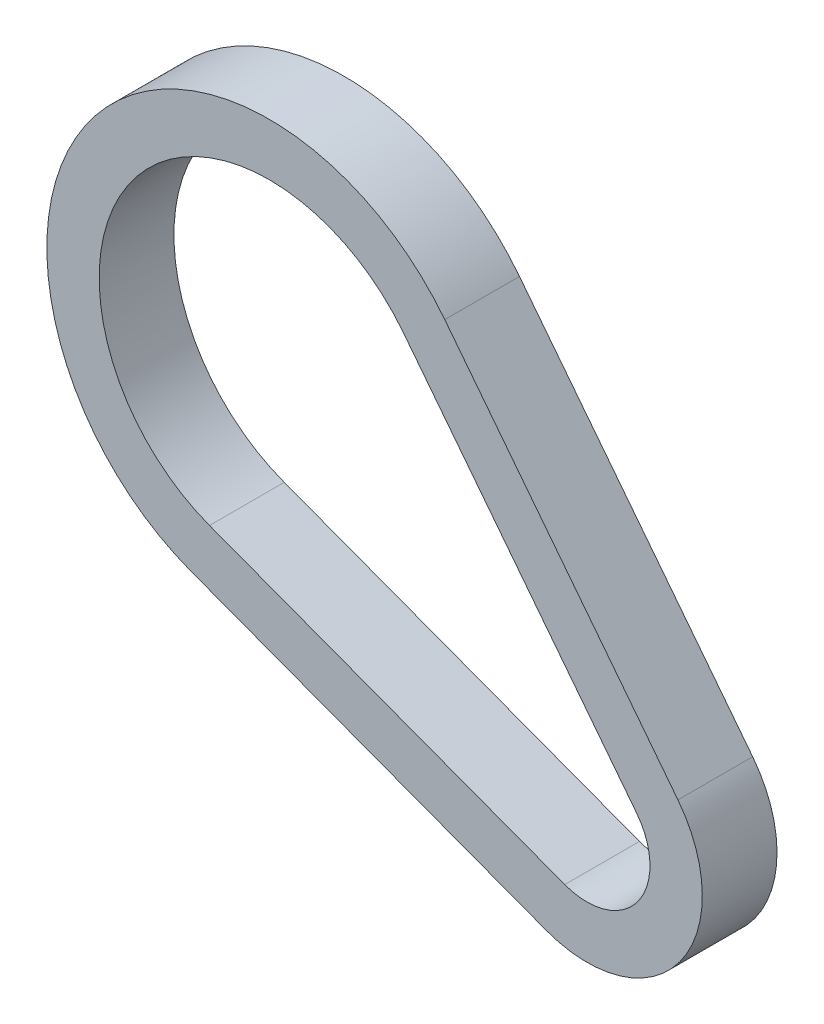
ISO-10303-21;
HEADER;
FILE_DESCRIPTION(('STEP AP214'),'2;1');
FILE_NAME('part.step','',(''),(''),'','','');
FILE_SCHEMA(('AUTOMOTIVE_DESIGN { 1 0 10303 214 1 1 1 1 }'));
ENDSEC;
DATA;
#1=APPLICATION_CONTEXT('core data for automotive mechanical design processes');
#2=APPLICATION_PROTOCOL_DEFINITION('international standard','automotive_design',2000,#1);
#3=PRODUCT_CONTEXT('',#1,'mechanical');
#4=PRODUCT('Part','Part','',(#3));
#5=PRODUCT_RELATED_PRODUCT_CATEGORY('part','',(#4));
#6=PRODUCT_DEFINITION_FORMATION('','',#4);
#7=PRODUCT_DEFINITION_CONTEXT('part definition',#1,'design');
#8=PRODUCT_DEFINITION('design','',#6,#7);
#9=PRODUCT_DEFINITION_SHAPE('','',#8);
#10=(LENGTH_UNIT() NAMED_UNIT(*) SI_UNIT(.MILLI.,.METRE.));
#11=(NAMED_UNIT(*) PLANE_ANGLE_UNIT() SI_UNIT($,.RADIAN.));
#12=(NAMED_UNIT(*) SI_UNIT($,.STERADIAN.) SOLID_ANGLE_UNIT());
#13=UNCERTAINTY_MEASURE_WITH_UNIT(LENGTH_MEASURE(1.E-05),#10,'distance_accuracy_value','');
#14=(GEOMETRIC_REPRESENTATION_CONTEXT(3) GLOBAL_UNCERTAINTY_ASSIGNED_CONTEXT((#13)) GLOBAL_UNIT_ASSIGNED_CONTEXT((#10,
#11,#12)) REPRESENTATION_CONTEXT('',''));
#15=CARTESIAN_POINT('',(0.,0.,0.));
#16=DIRECTION('',(0.,0.,1.));
#17=DIRECTION('',(1.,0.,0.));
#18=AXIS2_PLACEMENT_3D('',#15,#16,#17);
#19=CARTESIAN_POINT('',(0.,-1.26999999999999,6.35));
#20=DIRECTION('',(0.,0.,-1.));
#21=DIRECTION('',(-1.,0.,0.));
#22=AXIS2_PLACEMENT_3D('',#19,#20,#21);
#23=PLANE('',#22);
#24=CARTESIAN_POINT('',(0.,-1.26999999999999,6.35));
#25=DIRECTION('',(0.,0.,-1.));
#26=DIRECTION('',(-1.,0.,0.));
#27=AXIS2_PLACEMENT_3D('',#24,#25,#26);
#28=CIRCLE('',#27,37.7959183249067);
#29=CARTESIAN_POINT('',(29.8174975578945,21.9560259495241,6.35));
#30=VERTEX_POINT('',#29);
#31=CARTESIAN_POINT('',(-13.2817369108515,-36.6554052775143,6.35000000000001));
#32=VERTEX_POINT('',#31);
#33=EDGE_CURVE('E160',#30,#32,#28,.F.);
#34=ORIENTED_EDGE('',*,*,#33,.T.);
#35=DIRECTION('',(0.936222926860231,-0.351406646524028,0.));
#36=VECTOR('',#35,1.);
#37=CARTESIAN_POINT('',(-13.2817369108515,-36.6554052775144,6.35));
#38=LINE('',#37,#36);
#39=CARTESIAN_POINT('',(47.0858454711772,-59.3140788423401,6.35000000000001));
#40=VERTEX_POINT('',#39);
#41=EDGE_CURVE('E163',#32,#40,#38,.T.);
#42=ORIENTED_EDGE('',*,*,#41,.T.);
#43=CARTESIAN_POINT('',(53.9750000000002,-40.959888674437,6.35));
#44=DIRECTION('',(0.,0.,-1.));
#45=DIRECTION('',(-1.,0.,0.));
#46=AXIS2_PLACEMENT_3D('',#43,#44,#45);
#47=CIRCLE('',#46,19.604508329503);
#48=CARTESIAN_POINT('',(69.4411509799453,-28.9126931208197,6.35));
#49=VERTEX_POINT('',#48);
#50=EDGE_CURVE('E166',#40,#49,#47,.F.);
#51=ORIENTED_EDGE('',*,*,#50,.T.);
#52=DIRECTION('',(-0.614511486395575,0.788907873637918,0.));
#53=VECTOR('',#52,1.);
#54=CARTESIAN_POINT('',(29.8174975578946,21.9560259495241,6.35));
#55=LINE('',#54,#53);
#56=EDGE_CURVE('E168',#49,#30,#55,.T.);
#57=ORIENTED_EDGE('',*,*,#56,.T.);
#58=EDGE_LOOP('',(#34,#42,#51,#57));
#59=FACE_BOUND('',#58,.T.);
#60=CARTESIAN_POINT('',(0.,-1.26999999999999,6.35));
#61=DIRECTION('',(0.,0.,-1.));
#62=DIRECTION('',(-1.,0.,0.));
#63=AXIS2_PLACEMENT_3D('',#60,#61,#62);
#64=CIRCLE('',#63,28.9059183249067);
#65=CARTESIAN_POINT('',(22.8041065612535,16.4930188354675,6.35));
#66=VERTEX_POINT('',#65);
#67=CARTESIAN_POINT('',(-10.1577318232529,-28.3323834577269,6.35000000000001));
#68=VERTEX_POINT('',#67);
#69=EDGE_CURVE('E124',#66,#68,#64,.F.);
#70=ORIENTED_EDGE('',*,*,#69,.F.);
#71=DIRECTION('',(-0.614511486395575,0.788907873637918,0.));
#72=VECTOR('',#71,1.);
#73=CARTESIAN_POINT('',(22.8041065612535,16.4930188354675,6.35));
#74=LINE('',#73,#72);
#75=CARTESIAN_POINT('',(62.4277599833042,-34.3757002348763,6.35));
#76=VERTEX_POINT('',#75);
#77=EDGE_CURVE('E146',#76,#66,#74,.T.);
#78=ORIENTED_EDGE('',*,*,#77,.F.);
#79=CARTESIAN_POINT('',(53.9750000000002,-40.959888674437,6.35));
#80=DIRECTION('',(0.,0.,-1.));
#81=DIRECTION('',(-1.,0.,0.));
#82=AXIS2_PLACEMENT_3D('',#79,#80,#81);
#83=CIRCLE('',#82,10.714508329503);
#84=CARTESIAN_POINT('',(50.2098505587758,-50.9910570225527,6.35000000000001));
#85=VERTEX_POINT('',#84);
#86=EDGE_CURVE('E144',#85,#76,#83,.F.);
#87=ORIENTED_EDGE('',*,*,#86,.F.);
#88=DIRECTION('',(0.936222926860231,-0.351406646524028,0.));
#89=VECTOR('',#88,1.);
#90=CARTESIAN_POINT('',(-10.1577318232529,-28.3323834577269,6.35));
#91=LINE('',#90,#89);
#92=EDGE_CURVE('E132',#68,#85,#91,.T.);
#93=ORIENTED_EDGE('',*,*,#92,.F.);
#94=EDGE_LOOP('',(#70,#78,#87,#93));
#95=FACE_BOUND('',#94,.T.);
#96=ADVANCED_FACE('F59',(#59,#95),#23,.F.);
#97=CARTESIAN_POINT('',(0.,-1.26999999999999,-6.35));
#98=DIRECTION('',(0.,0.,-1.));
#99=DIRECTION('',(-1.,0.,0.));
#100=AXIS2_PLACEMENT_3D('',#97,#98,#99);
#101=PLANE('',#100);
#102=CARTESIAN_POINT('',(0.,-1.26999999999999,-6.35));
#103=DIRECTION('',(0.,0.,-1.));
#104=DIRECTION('',(-1.,0.,0.));
#105=AXIS2_PLACEMENT_3D('',#102,#103,#104);
#106=CIRCLE('',#105,37.7959183249067);
#107=CARTESIAN_POINT('',(29.8174975578945,21.9560259495241,-6.35));
#108=VERTEX_POINT('',#107);
#109=CARTESIAN_POINT('',(-13.2817369108515,-36.6554052775143,-6.34999999999999));
#110=VERTEX_POINT('',#109);
#111=EDGE_CURVE('E140',#108,#110,#106,.F.);
#112=ORIENTED_EDGE('',*,*,#111,.F.);
#113=DIRECTION('',(-0.614511486395575,0.788907873637918,0.));
#114=VECTOR('',#113,1.);
#115=CARTESIAN_POINT('',(29.8174975578946,21.9560259495241,-6.35));
#116=LINE('',#115,#114);
#117=CARTESIAN_POINT('',(69.4411509799453,-28.9126931208197,-6.35));
#118=VERTEX_POINT('',#117);
#119=EDGE_CURVE('E164',#118,#108,#116,.T.);
#120=ORIENTED_EDGE('',*,*,#119,.F.);
#121=CARTESIAN_POINT('',(53.9750000000002,-40.959888674437,-6.35));
#122=DIRECTION('',(0.,0.,-1.));
#123=DIRECTION('',(-1.,0.,0.));
#124=AXIS2_PLACEMENT_3D('',#121,#122,#123);
#125=CIRCLE('',#124,19.604508329503);
#126=CARTESIAN_POINT('',(47.0858454711772,-59.3140788423401,-6.34999999999999));
#127=VERTEX_POINT('',#126);
#128=EDGE_CURVE('E175',#127,#118,#125,.F.);
#129=ORIENTED_EDGE('',*,*,#128,.F.);
#130=DIRECTION('',(0.936222926860231,-0.351406646524028,0.));
#131=VECTOR('',#130,1.);
#132=CARTESIAN_POINT('',(-13.2817369108515,-36.6554052775144,-6.35));
#133=LINE('',#132,#131);
#134=EDGE_CURVE('E173',#110,#127,#133,.T.);
#135=ORIENTED_EDGE('',*,*,#134,.F.);
#136=EDGE_LOOP('',(#112,#120,#129,#135));
#137=FACE_BOUND('',#136,.T.);
#138=DIRECTION('',(-0.614511486395575,0.788907873637918,0.));
#139=VECTOR('',#138,1.);
#140=CARTESIAN_POINT('',(22.8041065612535,16.4930188354675,-6.35));
#141=LINE('',#140,#139);
#142=CARTESIAN_POINT('',(62.4277599833042,-34.3757002348763,-6.35));
#143=VERTEX_POINT('',#142);
#144=CARTESIAN_POINT('',(22.8041065612535,16.4930188354675,-6.35));
#145=VERTEX_POINT('',#144);
#146=EDGE_CURVE('E133',#143,#145,#141,.T.);
#147=ORIENTED_EDGE('',*,*,#146,.T.);
#148=CARTESIAN_POINT('',(0.,-1.26999999999999,-6.35));
#149=DIRECTION('',(0.,0.,-1.));
#150=DIRECTION('',(-1.,0.,0.));
#151=AXIS2_PLACEMENT_3D('',#148,#149,#150);
#152=CIRCLE('',#151,28.9059183249067);
#153=CARTESIAN_POINT('',(-10.1577318232529,-28.3323834577269,-6.34999999999999));
#154=VERTEX_POINT('',#153);
#155=EDGE_CURVE('E82',#145,#154,#152,.F.);
#156=ORIENTED_EDGE('',*,*,#155,.T.);
#157=DIRECTION('',(0.936222926860231,-0.351406646524028,0.));
#158=VECTOR('',#157,1.);
#159=CARTESIAN_POINT('',(-10.1577318232529,-28.3323834577269,-6.35));
#160=LINE('',#159,#158);
#161=CARTESIAN_POINT('',(50.2098505587758,-50.9910570225527,-6.34999999999999));
#162=VERTEX_POINT('',#161);
#163=EDGE_CURVE('E139',#154,#162,#160,.T.);
#164=ORIENTED_EDGE('',*,*,#163,.T.);
#165=CARTESIAN_POINT('',(53.9750000000002,-40.959888674437,-6.35));
#166=DIRECTION('',(0.,0.,-1.));
#167=DIRECTION('',(-1.,0.,0.));
#168=AXIS2_PLACEMENT_3D('',#165,#166,#167);
#169=CIRCLE('',#168,10.714508329503);
#170=EDGE_CURVE('E152',#162,#143,#169,.F.);
#171=ORIENTED_EDGE('',*,*,#170,.T.);
#172=EDGE_LOOP('',(#147,#156,#164,#171));
#173=FACE_BOUND('',#172,.T.);
#174=ADVANCED_FACE('F193',(#137,#173),#101,.T.);
#175=CARTESIAN_POINT('',(0.,-1.26999999999999,6.35));
#176=DIRECTION('',(0.,0.,-1.));
#177=DIRECTION('',(-1.,0.,0.));
#178=AXIS2_PLACEMENT_3D('',#175,#176,#177);
#179=CYLINDRICAL_SURFACE('',#178,37.7959183249067);
#180=ORIENTED_EDGE('',*,*,#111,.T.);
#181=DIRECTION('',(0.,0.,-1.));
#182=VECTOR('',#181,1.);
#183=CARTESIAN_POINT('',(-13.2817369108515,-36.6554052775143,6.35000000000001));
#184=LINE('',#183,#182);
#185=EDGE_CURVE('E12',#32,#110,#184,.T.);
#186=ORIENTED_EDGE('',*,*,#185,.F.);
#187=ORIENTED_EDGE('',*,*,#33,.F.);
#188=DIRECTION('',(0.,0.,-1.));
#189=VECTOR('',#188,1.);
#190=CARTESIAN_POINT('',(29.8174975578945,21.9560259495241,6.35));
#191=LINE('',#190,#189);
#192=EDGE_CURVE('E170',#30,#108,#191,.T.);
#193=ORIENTED_EDGE('',*,*,#192,.T.);
#194=EDGE_LOOP('',(#180,#186,#187,#193));
#195=FACE_BOUND('',#194,.T.);
#196=ADVANCED_FACE('F61',(#195),#179,.T.);
#197=CARTESIAN_POINT('',(-13.2817369108515,-36.6554052775144,6.35));
#198=DIRECTION('',(0.351406646524028,0.93622292686023,0.));
#199=DIRECTION('',(-0.936222926860231,0.351406646524028,0.));
#200=AXIS2_PLACEMENT_3D('',#197,#198,#199);
#201=PLANE('',#200);
#202=ORIENTED_EDGE('',*,*,#134,.T.);
#203=DIRECTION('',(0.,0.,-1.));
#204=VECTOR('',#203,1.);
#205=CARTESIAN_POINT('',(47.0858454711772,-59.3140788423401,6.35000000000001));
#206=LINE('',#205,#204);
#207=EDGE_CURVE('E67',#40,#127,#206,.T.);
#208=ORIENTED_EDGE('',*,*,#207,.F.);
#209=ORIENTED_EDGE('',*,*,#41,.F.);
#210=ORIENTED_EDGE('',*,*,#185,.T.);
#211=EDGE_LOOP('',(#202,#208,#209,#210));
#212=FACE_BOUND('',#211,.T.);
#213=ADVANCED_FACE('F203',(#212),#201,.F.);
#214=CARTESIAN_POINT('',(53.9750000000002,-40.959888674437,6.35));
#215=DIRECTION('',(0.,0.,-1.));
#216=DIRECTION('',(-1.,0.,0.));
#217=AXIS2_PLACEMENT_3D('',#214,#215,#216);
#218=CYLINDRICAL_SURFACE('',#217,19.604508329503);
#219=ORIENTED_EDGE('',*,*,#128,.T.);
#220=DIRECTION('',(0.,0.,-1.));
#221=VECTOR('',#220,1.);
#222=CARTESIAN_POINT('',(69.4411509799453,-28.9126931208197,6.35));
#223=LINE('',#222,#221);
#224=EDGE_CURVE('E180',#49,#118,#223,.T.);
#225=ORIENTED_EDGE('',*,*,#224,.F.);
#226=ORIENTED_EDGE('',*,*,#50,.F.);
#227=ORIENTED_EDGE('',*,*,#207,.T.);
#228=EDGE_LOOP('',(#219,#225,#226,#227));
#229=FACE_BOUND('',#228,.T.);
#230=ADVANCED_FACE('F187',(#229),#218,.T.);
#231=CARTESIAN_POINT('',(29.8174975578946,21.9560259495241,6.35));
#232=DIRECTION('',(-0.788907873637918,-0.614511486395575,0.));
#233=DIRECTION('',(0.614511486395575,-0.788907873637918,0.));
#234=AXIS2_PLACEMENT_3D('',#231,#232,#233);
#235=PLANE('',#234);
#236=ORIENTED_EDGE('',*,*,#119,.T.);
#237=ORIENTED_EDGE('',*,*,#192,.F.);
#238=ORIENTED_EDGE('',*,*,#56,.F.);
#239=ORIENTED_EDGE('',*,*,#224,.T.);
#240=EDGE_LOOP('',(#236,#237,#238,#239));
#241=FACE_BOUND('',#240,.T.);
#242=ADVANCED_FACE('F197',(#241),#235,.F.);
#243=CARTESIAN_POINT('',(0.,-1.26999999999999,6.35));
#244=DIRECTION('',(0.,0.,-1.));
#245=DIRECTION('',(-1.,0.,0.));
#246=AXIS2_PLACEMENT_3D('',#243,#244,#245);
#247=CYLINDRICAL_SURFACE('',#246,28.9059183249067);
#248=ORIENTED_EDGE('',*,*,#155,.F.);
#249=DIRECTION('',(0.,0.,-1.));
#250=VECTOR('',#249,1.);
#251=CARTESIAN_POINT('',(22.8041065612535,16.4930188354675,6.35));
#252=LINE('',#251,#250);
#253=EDGE_CURVE('E128',#66,#145,#252,.T.);
#254=ORIENTED_EDGE('',*,*,#253,.F.);
#255=ORIENTED_EDGE('',*,*,#69,.T.);
#256=DIRECTION('',(0.,0.,-1.));
#257=VECTOR('',#256,1.);
#258=CARTESIAN_POINT('',(-10.1577318232529,-28.3323834577269,6.35000000000001));
#259=LINE('',#258,#257);
#260=EDGE_CURVE('E127',#68,#154,#259,.T.);
#261=ORIENTED_EDGE('',*,*,#260,.T.);
#262=EDGE_LOOP('',(#248,#254,#255,#261));
#263=FACE_BOUND('',#262,.T.);
#264=ADVANCED_FACE('F126',(#263),#247,.F.);
#265=CARTESIAN_POINT('',(-10.1577318232529,-28.3323834577269,6.35));
#266=DIRECTION('',(0.351406646524028,0.93622292686023,0.));
#267=DIRECTION('',(-0.936222926860231,0.351406646524028,0.));
#268=AXIS2_PLACEMENT_3D('',#265,#266,#267);
#269=PLANE('',#268);
#270=ORIENTED_EDGE('',*,*,#163,.F.);
#271=ORIENTED_EDGE('',*,*,#260,.F.);
#272=ORIENTED_EDGE('',*,*,#92,.T.);
#273=DIRECTION('',(0.,0.,-1.));
#274=VECTOR('',#273,1.);
#275=CARTESIAN_POINT('',(50.2098505587758,-50.9910570225527,6.35000000000001));
#276=LINE('',#275,#274);
#277=EDGE_CURVE('E141',#85,#162,#276,.T.);
#278=ORIENTED_EDGE('',*,*,#277,.T.);
#279=EDGE_LOOP('',(#270,#271,#272,#278));
#280=FACE_BOUND('',#279,.T.);
#281=ADVANCED_FACE('F136',(#280),#269,.T.);
#282=CARTESIAN_POINT('',(53.9750000000002,-40.959888674437,6.35));
#283=DIRECTION('',(0.,0.,-1.));
#284=DIRECTION('',(-1.,0.,0.));
#285=AXIS2_PLACEMENT_3D('',#282,#283,#284);
#286=CYLINDRICAL_SURFACE('',#285,10.714508329503);
#287=ORIENTED_EDGE('',*,*,#170,.F.);
#288=ORIENTED_EDGE('',*,*,#277,.F.);
#289=ORIENTED_EDGE('',*,*,#86,.T.);
#290=DIRECTION('',(0.,0.,-1.));
#291=VECTOR('',#290,1.);
#292=CARTESIAN_POINT('',(62.4277599833042,-34.3757002348763,6.35));
#293=LINE('',#292,#291);
#294=EDGE_CURVE('E74',#76,#143,#293,.T.);
#295=ORIENTED_EDGE('',*,*,#294,.T.);
#296=EDGE_LOOP('',(#287,#288,#289,#295));
#297=FACE_BOUND('',#296,.T.);
#298=ADVANCED_FACE('F226',(#297),#286,.F.);
#299=CARTESIAN_POINT('',(22.8041065612535,16.4930188354675,6.35));
#300=DIRECTION('',(-0.788907873637918,-0.614511486395575,0.));
#301=DIRECTION('',(0.614511486395575,-0.788907873637918,0.));
#302=AXIS2_PLACEMENT_3D('',#299,#300,#301);
#303=PLANE('',#302);
#304=ORIENTED_EDGE('',*,*,#146,.F.);
#305=ORIENTED_EDGE('',*,*,#294,.F.);
#306=ORIENTED_EDGE('',*,*,#77,.T.);
#307=ORIENTED_EDGE('',*,*,#253,.T.);
#308=EDGE_LOOP('',(#304,#305,#306,#307));
#309=FACE_BOUND('',#308,.T.);
#310=ADVANCED_FACE('F230',(#309),#303,.T.);
#311=CLOSED_SHELL('',(#96,#174,#196,#213,#230,#242,#264,#281,#298,#310));
#312=MANIFOLD_SOLID_BREP('B2',#311);
#313=ADVANCED_BREP_SHAPE_REPRESENTATION('',(#18,#312),#14);
#314=SHAPE_DEFINITION_REPRESENTATION(#9,#313);
ENDSEC;
END-ISO-10303-21;
